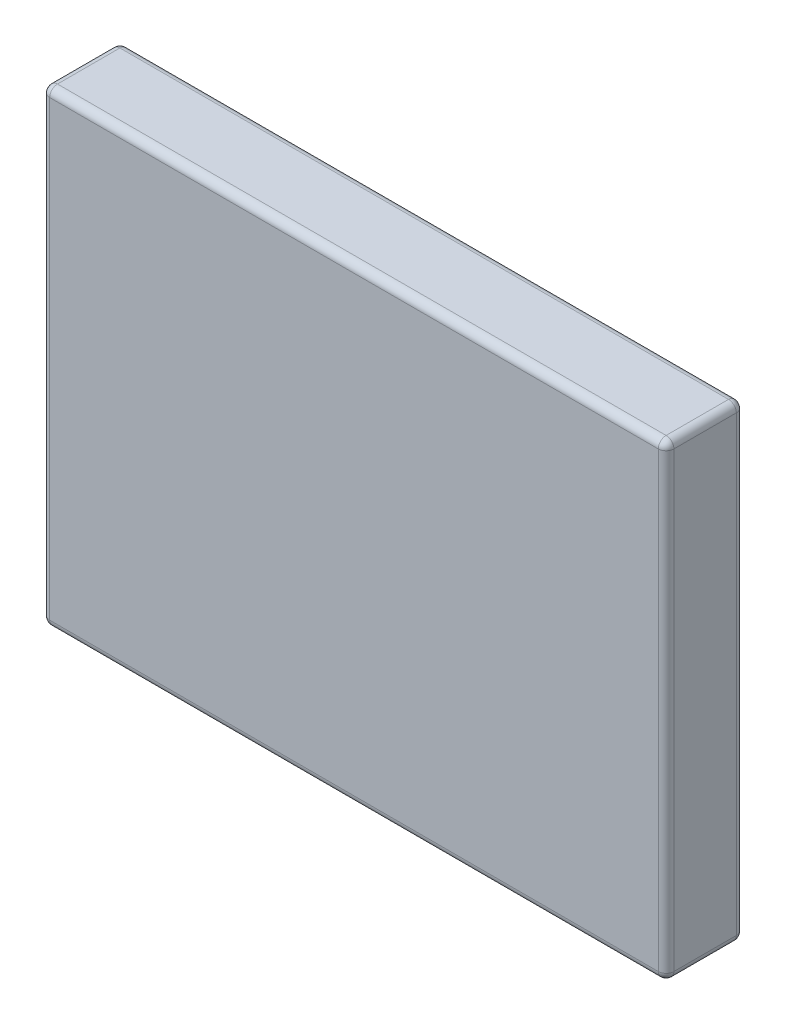
ISO-10303-21;
HEADER;
FILE_DESCRIPTION(('STEP AP214'),'2;1');
FILE_NAME('part.step','',(''),(''),'','','');
FILE_SCHEMA(('AUTOMOTIVE_DESIGN { 1 0 10303 214 1 1 1 1 }'));
ENDSEC;
DATA;
#1=APPLICATION_CONTEXT('core data for automotive mechanical design processes');
#2=APPLICATION_PROTOCOL_DEFINITION('international standard','automotive_design',2000,#1);
#3=PRODUCT_CONTEXT('',#1,'mechanical');
#4=PRODUCT('Part','Part','',(#3));
#5=PRODUCT_RELATED_PRODUCT_CATEGORY('part','',(#4));
#6=PRODUCT_DEFINITION_FORMATION('','',#4);
#7=PRODUCT_DEFINITION_CONTEXT('part definition',#1,'design');
#8=PRODUCT_DEFINITION('design','',#6,#7);
#9=PRODUCT_DEFINITION_SHAPE('','',#8);
#10=(LENGTH_UNIT() NAMED_UNIT(*) SI_UNIT(.MILLI.,.METRE.));
#11=(NAMED_UNIT(*) PLANE_ANGLE_UNIT() SI_UNIT($,.RADIAN.));
#12=(NAMED_UNIT(*) SI_UNIT($,.STERADIAN.) SOLID_ANGLE_UNIT());
#13=UNCERTAINTY_MEASURE_WITH_UNIT(LENGTH_MEASURE(1.E-05),#10,'distance_accuracy_value','');
#14=(GEOMETRIC_REPRESENTATION_CONTEXT(3) GLOBAL_UNCERTAINTY_ASSIGNED_CONTEXT((#13)) GLOBAL_UNIT_ASSIGNED_CONTEXT((#10,
#11,#12)) REPRESENTATION_CONTEXT('',''));
#15=CARTESIAN_POINT('',(0.,0.,0.));
#16=DIRECTION('',(0.,0.,1.));
#17=DIRECTION('',(1.,0.,0.));
#18=AXIS2_PLACEMENT_3D('',#15,#16,#17);
#19=CARTESIAN_POINT('',(0.,0.,12.7));
#20=DIRECTION('',(1.,0.,0.));
#21=DIRECTION('',(0.,0.,-1.));
#22=AXIS2_PLACEMENT_3D('',#19,#20,#21);
#23=PLANE('',#22);
#24=DIRECTION('',(0.,-1.,0.));
#25=VECTOR('',#24,1.);
#26=CARTESIAN_POINT('',(0.,0.,11.43));
#27=LINE('',#26,#25);
#28=CARTESIAN_POINT('',(0.,1.27,11.43));
#29=VERTEX_POINT('',#28);
#30=CARTESIAN_POINT('',(0.,74.93,11.43));
#31=VERTEX_POINT('',#30);
#32=EDGE_CURVE('E157',#29,#31,#27,.F.);
#33=ORIENTED_EDGE('',*,*,#32,.T.);
#34=DIRECTION('',(0.,0.,-1.));
#35=VECTOR('',#34,1.);
#36=CARTESIAN_POINT('',(0.,74.93,12.7));
#37=LINE('',#36,#35);
#38=CARTESIAN_POINT('',(0.,74.93,1.27));
#39=VERTEX_POINT('',#38);
#40=EDGE_CURVE('E165',#31,#39,#37,.T.);
#41=ORIENTED_EDGE('',*,*,#40,.T.);
#42=DIRECTION('',(0.,-1.,0.));
#43=VECTOR('',#42,1.);
#44=CARTESIAN_POINT('',(0.,0.,1.27));
#45=LINE('',#44,#43);
#46=CARTESIAN_POINT('',(0.,1.27,1.27));
#47=VERTEX_POINT('',#46);
#48=EDGE_CURVE('E137',#39,#47,#45,.T.);
#49=ORIENTED_EDGE('',*,*,#48,.T.);
#50=DIRECTION('',(0.,0.,-1.));
#51=VECTOR('',#50,1.);
#52=CARTESIAN_POINT('',(0.,1.27,12.7));
#53=LINE('',#52,#51);
#54=EDGE_CURVE('E152',#47,#29,#53,.F.);
#55=ORIENTED_EDGE('',*,*,#54,.T.);
#56=EDGE_LOOP('',(#33,#41,#49,#55));
#57=FACE_BOUND('',#56,.T.);
#58=ADVANCED_FACE('F39',(#57),#23,.F.);
#59=CARTESIAN_POINT('',(0.,0.,12.7));
#60=DIRECTION('',(0.,1.,0.));
#61=DIRECTION('',(0.,0.,1.));
#62=AXIS2_PLACEMENT_3D('',#59,#60,#61);
#63=PLANE('',#62);
#64=DIRECTION('',(1.,0.,0.));
#65=VECTOR('',#64,1.);
#66=CARTESIAN_POINT('',(101.6,0.,1.27));
#67=LINE('',#66,#65);
#68=CARTESIAN_POINT('',(1.27,0.,1.27));
#69=VERTEX_POINT('',#68);
#70=CARTESIAN_POINT('',(100.33,0.,1.27));
#71=VERTEX_POINT('',#70);
#72=EDGE_CURVE('E176',#69,#71,#67,.T.);
#73=ORIENTED_EDGE('',*,*,#72,.T.);
#74=DIRECTION('',(0.,0.,-1.));
#75=VECTOR('',#74,1.);
#76=CARTESIAN_POINT('',(100.33,0.,12.7));
#77=LINE('',#76,#75);
#78=CARTESIAN_POINT('',(100.33,0.,11.43));
#79=VERTEX_POINT('',#78);
#80=EDGE_CURVE('E185',#71,#79,#77,.F.);
#81=ORIENTED_EDGE('',*,*,#80,.T.);
#82=DIRECTION('',(1.,0.,0.));
#83=VECTOR('',#82,1.);
#84=CARTESIAN_POINT('',(0.,0.,11.43));
#85=LINE('',#84,#83);
#86=CARTESIAN_POINT('',(1.27,0.,11.43));
#87=VERTEX_POINT('',#86);
#88=EDGE_CURVE('E180',#79,#87,#85,.F.);
#89=ORIENTED_EDGE('',*,*,#88,.T.);
#90=DIRECTION('',(0.,0.,-1.));
#91=VECTOR('',#90,1.);
#92=CARTESIAN_POINT('',(1.27,0.,12.7));
#93=LINE('',#92,#91);
#94=EDGE_CURVE('E172',#87,#69,#93,.T.);
#95=ORIENTED_EDGE('',*,*,#94,.T.);
#96=EDGE_LOOP('',(#73,#81,#89,#95));
#97=FACE_BOUND('',#96,.T.);
#98=ADVANCED_FACE('F328',(#97),#63,.F.);
#99=CARTESIAN_POINT('',(101.6,0.,12.7));
#100=DIRECTION('',(-1.,0.,0.));
#101=DIRECTION('',(0.,0.,1.));
#102=AXIS2_PLACEMENT_3D('',#99,#100,#101);
#103=PLANE('',#102);
#104=DIRECTION('',(0.,1.,0.));
#105=VECTOR('',#104,1.);
#106=CARTESIAN_POINT('',(101.6,76.2,1.27));
#107=LINE('',#106,#105);
#108=CARTESIAN_POINT('',(101.6,1.27,1.27));
#109=VERTEX_POINT('',#108);
#110=CARTESIAN_POINT('',(101.6,74.93,1.27));
#111=VERTEX_POINT('',#110);
#112=EDGE_CURVE('E190',#109,#111,#107,.T.);
#113=ORIENTED_EDGE('',*,*,#112,.T.);
#114=DIRECTION('',(0.,0.,-1.));
#115=VECTOR('',#114,1.);
#116=CARTESIAN_POINT('',(101.6,74.93,12.7));
#117=LINE('',#116,#115);
#118=CARTESIAN_POINT('',(101.6,74.93,11.43));
#119=VERTEX_POINT('',#118);
#120=EDGE_CURVE('E192',#111,#119,#117,.F.);
#121=ORIENTED_EDGE('',*,*,#120,.T.);
#122=DIRECTION('',(0.,1.,0.));
#123=VECTOR('',#122,1.);
#124=CARTESIAN_POINT('',(101.6,0.,11.43));
#125=LINE('',#124,#123);
#126=CARTESIAN_POINT('',(101.6,1.27,11.43));
#127=VERTEX_POINT('',#126);
#128=EDGE_CURVE('E189',#119,#127,#125,.F.);
#129=ORIENTED_EDGE('',*,*,#128,.T.);
#130=DIRECTION('',(0.,0.,-1.));
#131=VECTOR('',#130,1.);
#132=CARTESIAN_POINT('',(101.6,1.27,12.7));
#133=LINE('',#132,#131);
#134=EDGE_CURVE('E184',#127,#109,#133,.T.);
#135=ORIENTED_EDGE('',*,*,#134,.T.);
#136=EDGE_LOOP('',(#113,#121,#129,#135));
#137=FACE_BOUND('',#136,.T.);
#138=ADVANCED_FACE('F298',(#137),#103,.F.);
#139=CARTESIAN_POINT('',(0.,76.2,12.7));
#140=DIRECTION('',(0.,-1.,0.));
#141=DIRECTION('',(0.,0.,-1.));
#142=AXIS2_PLACEMENT_3D('',#139,#140,#141);
#143=PLANE('',#142);
#144=DIRECTION('',(-1.,0.,0.));
#145=VECTOR('',#144,1.);
#146=CARTESIAN_POINT('',(0.,76.2,1.27));
#147=LINE('',#146,#145);
#148=CARTESIAN_POINT('',(100.33,76.2,1.27));
#149=VERTEX_POINT('',#148);
#150=CARTESIAN_POINT('',(1.27,76.2,1.27));
#151=VERTEX_POINT('',#150);
#152=EDGE_CURVE('E197',#149,#151,#147,.T.);
#153=ORIENTED_EDGE('',*,*,#152,.T.);
#154=DIRECTION('',(0.,0.,-1.));
#155=VECTOR('',#154,1.);
#156=CARTESIAN_POINT('',(1.27,76.2,12.7));
#157=LINE('',#156,#155);
#158=CARTESIAN_POINT('',(1.27,76.2,11.43));
#159=VERTEX_POINT('',#158);
#160=EDGE_CURVE('E199',#151,#159,#157,.F.);
#161=ORIENTED_EDGE('',*,*,#160,.T.);
#162=DIRECTION('',(-1.,0.,0.));
#163=VECTOR('',#162,1.);
#164=CARTESIAN_POINT('',(0.,76.2,11.43));
#165=LINE('',#164,#163);
#166=CARTESIAN_POINT('',(100.33,76.2,11.43));
#167=VERTEX_POINT('',#166);
#168=EDGE_CURVE('E193',#159,#167,#165,.F.);
#169=ORIENTED_EDGE('',*,*,#168,.T.);
#170=DIRECTION('',(0.,0.,-1.));
#171=VECTOR('',#170,1.);
#172=CARTESIAN_POINT('',(100.33,76.2,12.7));
#173=LINE('',#172,#171);
#174=EDGE_CURVE('E194',#167,#149,#173,.T.);
#175=ORIENTED_EDGE('',*,*,#174,.T.);
#176=EDGE_LOOP('',(#153,#161,#169,#175));
#177=FACE_BOUND('',#176,.T.);
#178=ADVANCED_FACE('F274',(#177),#143,.F.);
#179=CARTESIAN_POINT('',(0.,0.,12.7));
#180=DIRECTION('',(0.,0.,-1.));
#181=DIRECTION('',(-1.,0.,0.));
#182=AXIS2_PLACEMENT_3D('',#179,#180,#181);
#183=PLANE('',#182);
#184=DIRECTION('',(-1.,0.,0.));
#185=VECTOR('',#184,1.);
#186=CARTESIAN_POINT('',(0.,74.93,12.7));
#187=LINE('',#186,#185);
#188=CARTESIAN_POINT('',(100.33,74.93,12.7));
#189=VERTEX_POINT('',#188);
#190=CARTESIAN_POINT('',(1.27,74.93,12.7));
#191=VERTEX_POINT('',#190);
#192=EDGE_CURVE('E205',#189,#191,#187,.T.);
#193=ORIENTED_EDGE('',*,*,#192,.T.);
#194=DIRECTION('',(0.,-1.,0.));
#195=VECTOR('',#194,1.);
#196=CARTESIAN_POINT('',(1.27,0.,12.7));
#197=LINE('',#196,#195);
#198=CARTESIAN_POINT('',(1.27,1.27,12.7));
#199=VERTEX_POINT('',#198);
#200=EDGE_CURVE('E11',#191,#199,#197,.T.);
#201=ORIENTED_EDGE('',*,*,#200,.T.);
#202=DIRECTION('',(1.,0.,0.));
#203=VECTOR('',#202,1.);
#204=CARTESIAN_POINT('',(0.,1.27,12.7));
#205=LINE('',#204,#203);
#206=CARTESIAN_POINT('',(100.33,1.27,12.7));
#207=VERTEX_POINT('',#206);
#208=EDGE_CURVE('E48',#199,#207,#205,.T.);
#209=ORIENTED_EDGE('',*,*,#208,.T.);
#210=DIRECTION('',(0.,1.,0.));
#211=VECTOR('',#210,1.);
#212=CARTESIAN_POINT('',(100.33,0.,12.7));
#213=LINE('',#212,#211);
#214=EDGE_CURVE('E204',#207,#189,#213,.T.);
#215=ORIENTED_EDGE('',*,*,#214,.T.);
#216=EDGE_LOOP('',(#193,#201,#209,#215));
#217=FACE_BOUND('',#216,.T.);
#218=ADVANCED_FACE('F285',(#217),#183,.F.);
#219=CARTESIAN_POINT('',(0.,0.,0.));
#220=DIRECTION('',(0.,0.,-1.));
#221=DIRECTION('',(-1.,0.,0.));
#222=AXIS2_PLACEMENT_3D('',#219,#220,#221);
#223=PLANE('',#222);
#224=DIRECTION('',(1.,0.,0.));
#225=VECTOR('',#224,1.);
#226=CARTESIAN_POINT('',(0.,1.27,0.));
#227=LINE('',#226,#225);
#228=CARTESIAN_POINT('',(100.33,1.27,0.));
#229=VERTEX_POINT('',#228);
#230=CARTESIAN_POINT('',(1.27,1.27,0.));
#231=VERTEX_POINT('',#230);
#232=EDGE_CURVE('E171',#229,#231,#227,.F.);
#233=ORIENTED_EDGE('',*,*,#232,.T.);
#234=DIRECTION('',(0.,-1.,0.));
#235=VECTOR('',#234,1.);
#236=CARTESIAN_POINT('',(1.27,76.2,0.));
#237=LINE('',#236,#235);
#238=CARTESIAN_POINT('',(1.27,74.93,0.));
#239=VERTEX_POINT('',#238);
#240=EDGE_CURVE('E139',#231,#239,#237,.F.);
#241=ORIENTED_EDGE('',*,*,#240,.T.);
#242=DIRECTION('',(-1.,0.,0.));
#243=VECTOR('',#242,1.);
#244=CARTESIAN_POINT('',(101.6,74.93,0.));
#245=LINE('',#244,#243);
#246=CARTESIAN_POINT('',(100.33,74.93,0.));
#247=VERTEX_POINT('',#246);
#248=EDGE_CURVE('E164',#239,#247,#245,.F.);
#249=ORIENTED_EDGE('',*,*,#248,.T.);
#250=DIRECTION('',(0.,1.,0.));
#251=VECTOR('',#250,1.);
#252=CARTESIAN_POINT('',(100.33,0.,0.));
#253=LINE('',#252,#251);
#254=EDGE_CURVE('E168',#247,#229,#253,.F.);
#255=ORIENTED_EDGE('',*,*,#254,.T.);
#256=EDGE_LOOP('',(#233,#241,#249,#255));
#257=FACE_BOUND('',#256,.T.);
#258=ADVANCED_FACE('F362',(#257),#223,.T.);
#259=CARTESIAN_POINT('',(100.33,0.,11.43));
#260=DIRECTION('',(0.,1.,0.));
#261=DIRECTION('',(0.,0.,1.));
#262=AXIS2_PLACEMENT_3D('',#259,#260,#261);
#263=CYLINDRICAL_SURFACE('',#262,1.27);
#264=CARTESIAN_POINT('',(100.33,74.93,11.43));
#265=DIRECTION('',(0.,1.,0.));
#266=DIRECTION('',(0.,0.,1.));
#267=AXIS2_PLACEMENT_3D('',#264,#265,#266);
#268=CIRCLE('',#267,1.27);
#269=EDGE_CURVE('E43',#189,#119,#268,.T.);
#270=ORIENTED_EDGE('',*,*,#269,.F.);
#271=ORIENTED_EDGE('',*,*,#214,.F.);
#272=CARTESIAN_POINT('',(100.33,1.27,11.43));
#273=DIRECTION('',(0.,-1.,0.));
#274=DIRECTION('',(0.,0.,-1.));
#275=AXIS2_PLACEMENT_3D('',#272,#273,#274);
#276=CIRCLE('',#275,1.27);
#277=EDGE_CURVE('E251',#127,#207,#276,.T.);
#278=ORIENTED_EDGE('',*,*,#277,.F.);
#279=ORIENTED_EDGE('',*,*,#128,.F.);
#280=EDGE_LOOP('',(#270,#271,#278,#279));
#281=FACE_BOUND('',#280,.T.);
#282=ADVANCED_FACE('F41',(#281),#263,.T.);
#283=CARTESIAN_POINT('',(100.33,74.93,11.43));
#284=DIRECTION('',(1.,0.,0.));
#285=DIRECTION('',(0.,0.,-1.));
#286=AXIS2_PLACEMENT_3D('',#283,#284,#285);
#287=SPHERICAL_SURFACE('',#286,1.27);
#288=CARTESIAN_POINT('',(100.33,74.93,11.43));
#289=DIRECTION('',(1.,0.,0.));
#290=DIRECTION('',(0.,0.,-1.));
#291=AXIS2_PLACEMENT_3D('',#288,#289,#290);
#292=CIRCLE('',#291,1.27);
#293=EDGE_CURVE('E249',#189,#167,#292,.F.);
#294=ORIENTED_EDGE('',*,*,#293,.F.);
#295=ORIENTED_EDGE('',*,*,#269,.T.);
#296=CARTESIAN_POINT('',(100.33,74.93,11.43));
#297=DIRECTION('',(0.,0.,1.));
#298=DIRECTION('',(1.,0.,0.));
#299=AXIS2_PLACEMENT_3D('',#296,#297,#298);
#300=CIRCLE('',#299,1.27);
#301=EDGE_CURVE('E253',#167,#119,#300,.F.);
#302=ORIENTED_EDGE('',*,*,#301,.F.);
#303=EDGE_LOOP('',(#294,#295,#302));
#304=FACE_BOUND('',#303,.T.);
#305=ADVANCED_FACE('F262',(#304),#287,.T.);
#306=CARTESIAN_POINT('',(100.33,1.27,11.43));
#307=DIRECTION('',(0.,0.,1.));
#308=DIRECTION('',(1.,0.,0.));
#309=AXIS2_PLACEMENT_3D('',#306,#307,#308);
#310=SPHERICAL_SURFACE('',#309,1.27);
#311=CARTESIAN_POINT('',(100.33,1.27,11.43));
#312=DIRECTION('',(0.,0.,1.));
#313=DIRECTION('',(1.,0.,0.));
#314=AXIS2_PLACEMENT_3D('',#311,#312,#313);
#315=CIRCLE('',#314,1.27);
#316=EDGE_CURVE('E241',#127,#79,#315,.F.);
#317=ORIENTED_EDGE('',*,*,#316,.F.);
#318=ORIENTED_EDGE('',*,*,#277,.T.);
#319=CARTESIAN_POINT('',(100.33,1.27,11.43));
#320=DIRECTION('',(1.,0.,0.));
#321=DIRECTION('',(0.,0.,-1.));
#322=AXIS2_PLACEMENT_3D('',#319,#320,#321);
#323=CIRCLE('',#322,1.27);
#324=EDGE_CURVE('E242',#79,#207,#323,.F.);
#325=ORIENTED_EDGE('',*,*,#324,.F.);
#326=EDGE_LOOP('',(#317,#318,#325));
#327=FACE_BOUND('',#326,.T.);
#328=ADVANCED_FACE('F292',(#327),#310,.T.);
#329=CARTESIAN_POINT('',(100.33,74.93,12.7));
#330=DIRECTION('',(0.,0.,-1.));
#331=DIRECTION('',(-1.,0.,0.));
#332=AXIS2_PLACEMENT_3D('',#329,#330,#331);
#333=CYLINDRICAL_SURFACE('',#332,1.27);
#334=ORIENTED_EDGE('',*,*,#301,.T.);
#335=ORIENTED_EDGE('',*,*,#120,.F.);
#336=CARTESIAN_POINT('',(100.33,74.93,1.27));
#337=DIRECTION('',(0.,0.,-1.));
#338=DIRECTION('',(-1.,0.,0.));
#339=AXIS2_PLACEMENT_3D('',#336,#337,#338);
#340=CIRCLE('',#339,1.27);
#341=EDGE_CURVE('E240',#149,#111,#340,.T.);
#342=ORIENTED_EDGE('',*,*,#341,.F.);
#343=ORIENTED_EDGE('',*,*,#174,.F.);
#344=EDGE_LOOP('',(#334,#335,#342,#343));
#345=FACE_BOUND('',#344,.T.);
#346=ADVANCED_FACE('F271',(#345),#333,.T.);
#347=CARTESIAN_POINT('',(0.,74.93,11.43));
#348=DIRECTION('',(-1.,0.,0.));
#349=DIRECTION('',(0.,0.,1.));
#350=AXIS2_PLACEMENT_3D('',#347,#348,#349);
#351=CYLINDRICAL_SURFACE('',#350,1.27);
#352=ORIENTED_EDGE('',*,*,#293,.T.);
#353=ORIENTED_EDGE('',*,*,#168,.F.);
#354=CARTESIAN_POINT('',(1.27,74.93,11.43));
#355=DIRECTION('',(-1.,0.,0.));
#356=DIRECTION('',(0.,0.,1.));
#357=AXIS2_PLACEMENT_3D('',#354,#355,#356);
#358=CIRCLE('',#357,1.27);
#359=EDGE_CURVE('E231',#191,#159,#358,.T.);
#360=ORIENTED_EDGE('',*,*,#359,.F.);
#361=ORIENTED_EDGE('',*,*,#192,.F.);
#362=EDGE_LOOP('',(#352,#353,#360,#361));
#363=FACE_BOUND('',#362,.T.);
#364=ADVANCED_FACE('F284',(#363),#351,.T.);
#365=CARTESIAN_POINT('',(1.27,0.,11.43));
#366=DIRECTION('',(0.,-1.,0.));
#367=DIRECTION('',(0.,0.,-1.));
#368=AXIS2_PLACEMENT_3D('',#365,#366,#367);
#369=CYLINDRICAL_SURFACE('',#368,1.27);
#370=CARTESIAN_POINT('',(1.27,1.27,11.43));
#371=DIRECTION('',(0.,-1.,0.));
#372=DIRECTION('',(0.,0.,-1.));
#373=AXIS2_PLACEMENT_3D('',#370,#371,#372);
#374=CIRCLE('',#373,1.27);
#375=EDGE_CURVE('E228',#199,#29,#374,.T.);
#376=ORIENTED_EDGE('',*,*,#375,.F.);
#377=ORIENTED_EDGE('',*,*,#200,.F.);
#378=CARTESIAN_POINT('',(1.27,74.93,11.43));
#379=DIRECTION('',(0.,1.,0.));
#380=DIRECTION('',(0.,0.,1.));
#381=AXIS2_PLACEMENT_3D('',#378,#379,#380);
#382=CIRCLE('',#381,1.27);
#383=EDGE_CURVE('E232',#31,#191,#382,.T.);
#384=ORIENTED_EDGE('',*,*,#383,.F.);
#385=ORIENTED_EDGE('',*,*,#32,.F.);
#386=EDGE_LOOP('',(#376,#377,#384,#385));
#387=FACE_BOUND('',#386,.T.);
#388=ADVANCED_FACE('F287',(#387),#369,.T.);
#389=CARTESIAN_POINT('',(0.,1.27,11.43));
#390=DIRECTION('',(1.,0.,0.));
#391=DIRECTION('',(0.,0.,-1.));
#392=AXIS2_PLACEMENT_3D('',#389,#390,#391);
#393=CYLINDRICAL_SURFACE('',#392,1.27);
#394=ORIENTED_EDGE('',*,*,#324,.T.);
#395=ORIENTED_EDGE('',*,*,#208,.F.);
#396=CARTESIAN_POINT('',(1.27,1.27,11.43));
#397=DIRECTION('',(-1.,0.,0.));
#398=DIRECTION('',(0.,0.,1.));
#399=AXIS2_PLACEMENT_3D('',#396,#397,#398);
#400=CIRCLE('',#399,1.27);
#401=EDGE_CURVE('E57',#87,#199,#400,.T.);
#402=ORIENTED_EDGE('',*,*,#401,.F.);
#403=ORIENTED_EDGE('',*,*,#88,.F.);
#404=EDGE_LOOP('',(#394,#395,#402,#403));
#405=FACE_BOUND('',#404,.T.);
#406=ADVANCED_FACE('F286',(#405),#393,.T.);
#407=CARTESIAN_POINT('',(100.33,1.27,12.7));
#408=DIRECTION('',(0.,0.,-1.));
#409=DIRECTION('',(-1.,0.,0.));
#410=AXIS2_PLACEMENT_3D('',#407,#408,#409);
#411=CYLINDRICAL_SURFACE('',#410,1.27);
#412=ORIENTED_EDGE('',*,*,#316,.T.);
#413=ORIENTED_EDGE('',*,*,#80,.F.);
#414=CARTESIAN_POINT('',(100.33,1.27,1.27));
#415=DIRECTION('',(0.,0.,-1.));
#416=DIRECTION('',(-1.,0.,0.));
#417=AXIS2_PLACEMENT_3D('',#414,#415,#416);
#418=CIRCLE('',#417,1.27);
#419=EDGE_CURVE('E223',#109,#71,#418,.T.);
#420=ORIENTED_EDGE('',*,*,#419,.F.);
#421=ORIENTED_EDGE('',*,*,#134,.F.);
#422=EDGE_LOOP('',(#412,#413,#420,#421));
#423=FACE_BOUND('',#422,.T.);
#424=ADVANCED_FACE('F299',(#423),#411,.T.);
#425=CARTESIAN_POINT('',(100.33,0.,1.27));
#426=DIRECTION('',(0.,-1.,0.));
#427=DIRECTION('',(0.,0.,-1.));
#428=AXIS2_PLACEMENT_3D('',#425,#426,#427);
#429=CYLINDRICAL_SURFACE('',#428,1.27);
#430=CARTESIAN_POINT('',(100.33,74.93,1.27));
#431=DIRECTION('',(0.,1.,0.));
#432=DIRECTION('',(0.,0.,1.));
#433=AXIS2_PLACEMENT_3D('',#430,#431,#432);
#434=CIRCLE('',#433,1.27);
#435=EDGE_CURVE('E239',#111,#247,#434,.T.);
#436=ORIENTED_EDGE('',*,*,#435,.F.);
#437=ORIENTED_EDGE('',*,*,#112,.F.);
#438=CARTESIAN_POINT('',(100.33,1.27,1.27));
#439=DIRECTION('',(0.,-1.,0.));
#440=DIRECTION('',(0.,0.,-1.));
#441=AXIS2_PLACEMENT_3D('',#438,#439,#440);
#442=CIRCLE('',#441,1.27);
#443=EDGE_CURVE('E225',#229,#109,#442,.T.);
#444=ORIENTED_EDGE('',*,*,#443,.F.);
#445=ORIENTED_EDGE('',*,*,#254,.F.);
#446=EDGE_LOOP('',(#436,#437,#444,#445));
#447=FACE_BOUND('',#446,.T.);
#448=ADVANCED_FACE('F304',(#447),#429,.T.);
#449=CARTESIAN_POINT('',(100.33,74.93,1.27));
#450=DIRECTION('',(1.,0.,0.));
#451=DIRECTION('',(0.,0.,-1.));
#452=AXIS2_PLACEMENT_3D('',#449,#450,#451);
#453=SPHERICAL_SURFACE('',#452,1.27);
#454=ORIENTED_EDGE('',*,*,#341,.T.);
#455=ORIENTED_EDGE('',*,*,#435,.T.);
#456=CARTESIAN_POINT('',(100.33,74.93,1.27));
#457=DIRECTION('',(1.,0.,0.));
#458=DIRECTION('',(0.,0.,-1.));
#459=AXIS2_PLACEMENT_3D('',#456,#457,#458);
#460=CIRCLE('',#459,1.27);
#461=EDGE_CURVE('E218',#149,#247,#460,.F.);
#462=ORIENTED_EDGE('',*,*,#461,.F.);
#463=EDGE_LOOP('',(#454,#455,#462));
#464=FACE_BOUND('',#463,.T.);
#465=ADVANCED_FACE('F307',(#464),#453,.T.);
#466=CARTESIAN_POINT('',(1.27,74.93,11.43));
#467=DIRECTION('',(0.,0.,1.));
#468=DIRECTION('',(1.,0.,0.));
#469=AXIS2_PLACEMENT_3D('',#466,#467,#468);
#470=SPHERICAL_SURFACE('',#469,1.27);
#471=ORIENTED_EDGE('',*,*,#383,.T.);
#472=ORIENTED_EDGE('',*,*,#359,.T.);
#473=CARTESIAN_POINT('',(1.27,74.93,11.43));
#474=DIRECTION('',(0.,0.,1.));
#475=DIRECTION('',(1.,0.,0.));
#476=AXIS2_PLACEMENT_3D('',#473,#474,#475);
#477=CIRCLE('',#476,1.27);
#478=EDGE_CURVE('E216',#31,#159,#477,.F.);
#479=ORIENTED_EDGE('',*,*,#478,.F.);
#480=EDGE_LOOP('',(#471,#472,#479));
#481=FACE_BOUND('',#480,.T.);
#482=ADVANCED_FACE('F320',(#481),#470,.T.);
#483=CARTESIAN_POINT('',(1.27,1.27,11.43));
#484=DIRECTION('',(0.,0.,1.));
#485=DIRECTION('',(1.,0.,0.));
#486=AXIS2_PLACEMENT_3D('',#483,#484,#485);
#487=SPHERICAL_SURFACE('',#486,1.27);
#488=ORIENTED_EDGE('',*,*,#401,.T.);
#489=ORIENTED_EDGE('',*,*,#375,.T.);
#490=CARTESIAN_POINT('',(1.27,1.27,11.43));
#491=DIRECTION('',(0.,0.,1.));
#492=DIRECTION('',(1.,0.,0.));
#493=AXIS2_PLACEMENT_3D('',#490,#491,#492);
#494=CIRCLE('',#493,1.27);
#495=EDGE_CURVE('E156',#87,#29,#494,.F.);
#496=ORIENTED_EDGE('',*,*,#495,.F.);
#497=EDGE_LOOP('',(#488,#489,#496));
#498=FACE_BOUND('',#497,.T.);
#499=ADVANCED_FACE('F317',(#498),#487,.T.);
#500=CARTESIAN_POINT('',(100.33,1.27,1.27));
#501=DIRECTION('',(1.,0.,0.));
#502=DIRECTION('',(0.,0.,-1.));
#503=AXIS2_PLACEMENT_3D('',#500,#501,#502);
#504=SPHERICAL_SURFACE('',#503,1.27);
#505=ORIENTED_EDGE('',*,*,#443,.T.);
#506=ORIENTED_EDGE('',*,*,#419,.T.);
#507=CARTESIAN_POINT('',(100.33,1.27,1.27));
#508=DIRECTION('',(1.,0.,0.));
#509=DIRECTION('',(0.,0.,-1.));
#510=AXIS2_PLACEMENT_3D('',#507,#508,#509);
#511=CIRCLE('',#510,1.27);
#512=EDGE_CURVE('E213',#229,#71,#511,.F.);
#513=ORIENTED_EDGE('',*,*,#512,.F.);
#514=EDGE_LOOP('',(#505,#506,#513));
#515=FACE_BOUND('',#514,.T.);
#516=ADVANCED_FACE('F324',(#515),#504,.T.);
#517=CARTESIAN_POINT('',(0.,74.93,1.27));
#518=DIRECTION('',(1.,0.,0.));
#519=DIRECTION('',(0.,0.,-1.));
#520=AXIS2_PLACEMENT_3D('',#517,#518,#519);
#521=CYLINDRICAL_SURFACE('',#520,1.27);
#522=ORIENTED_EDGE('',*,*,#461,.T.);
#523=ORIENTED_EDGE('',*,*,#248,.F.);
#524=CARTESIAN_POINT('',(1.27,74.93,1.27));
#525=DIRECTION('',(-1.,0.,0.));
#526=DIRECTION('',(0.,0.,1.));
#527=AXIS2_PLACEMENT_3D('',#524,#525,#526);
#528=CIRCLE('',#527,1.27);
#529=EDGE_CURVE('E209',#151,#239,#528,.T.);
#530=ORIENTED_EDGE('',*,*,#529,.F.);
#531=ORIENTED_EDGE('',*,*,#152,.F.);
#532=EDGE_LOOP('',(#522,#523,#530,#531));
#533=FACE_BOUND('',#532,.T.);
#534=ADVANCED_FACE('F309',(#533),#521,.T.);
#535=CARTESIAN_POINT('',(1.27,74.93,12.7));
#536=DIRECTION('',(0.,0.,-1.));
#537=DIRECTION('',(-1.,0.,0.));
#538=AXIS2_PLACEMENT_3D('',#535,#536,#537);
#539=CYLINDRICAL_SURFACE('',#538,1.27);
#540=ORIENTED_EDGE('',*,*,#478,.T.);
#541=ORIENTED_EDGE('',*,*,#160,.F.);
#542=CARTESIAN_POINT('',(1.27,74.93,1.27));
#543=DIRECTION('',(0.,0.,-1.));
#544=DIRECTION('',(-1.,0.,0.));
#545=AXIS2_PLACEMENT_3D('',#542,#543,#544);
#546=CIRCLE('',#545,1.27);
#547=EDGE_CURVE('E151',#39,#151,#546,.T.);
#548=ORIENTED_EDGE('',*,*,#547,.F.);
#549=ORIENTED_EDGE('',*,*,#40,.F.);
#550=EDGE_LOOP('',(#540,#541,#548,#549));
#551=FACE_BOUND('',#550,.T.);
#552=ADVANCED_FACE('F312',(#551),#539,.T.);
#553=CARTESIAN_POINT('',(1.27,1.27,12.7));
#554=DIRECTION('',(0.,0.,-1.));
#555=DIRECTION('',(-1.,0.,0.));
#556=AXIS2_PLACEMENT_3D('',#553,#554,#555);
#557=CYLINDRICAL_SURFACE('',#556,1.27);
#558=ORIENTED_EDGE('',*,*,#495,.T.);
#559=ORIENTED_EDGE('',*,*,#54,.F.);
#560=CARTESIAN_POINT('',(1.27,1.27,1.27));
#561=DIRECTION('',(0.,0.,-1.));
#562=DIRECTION('',(-1.,0.,0.));
#563=AXIS2_PLACEMENT_3D('',#560,#561,#562);
#564=CIRCLE('',#563,1.27);
#565=EDGE_CURVE('E145',#69,#47,#564,.T.);
#566=ORIENTED_EDGE('',*,*,#565,.F.);
#567=ORIENTED_EDGE('',*,*,#94,.F.);
#568=EDGE_LOOP('',(#558,#559,#566,#567));
#569=FACE_BOUND('',#568,.T.);
#570=ADVANCED_FACE('F154',(#569),#557,.T.);
#571=CARTESIAN_POINT('',(0.,1.27,1.27));
#572=DIRECTION('',(-1.,0.,0.));
#573=DIRECTION('',(0.,0.,1.));
#574=AXIS2_PLACEMENT_3D('',#571,#572,#573);
#575=CYLINDRICAL_SURFACE('',#574,1.27);
#576=ORIENTED_EDGE('',*,*,#512,.T.);
#577=ORIENTED_EDGE('',*,*,#72,.F.);
#578=CARTESIAN_POINT('',(1.27,1.27,1.27));
#579=DIRECTION('',(-1.,0.,0.));
#580=DIRECTION('',(0.,0.,1.));
#581=AXIS2_PLACEMENT_3D('',#578,#579,#580);
#582=CIRCLE('',#581,1.27);
#583=EDGE_CURVE('E146',#231,#69,#582,.T.);
#584=ORIENTED_EDGE('',*,*,#583,.F.);
#585=ORIENTED_EDGE('',*,*,#232,.F.);
#586=EDGE_LOOP('',(#576,#577,#584,#585));
#587=FACE_BOUND('',#586,.T.);
#588=ADVANCED_FACE('F343',(#587),#575,.T.);
#589=CARTESIAN_POINT('',(1.27,74.93,1.27));
#590=DIRECTION('',(0.,1.,0.));
#591=DIRECTION('',(0.,0.,1.));
#592=AXIS2_PLACEMENT_3D('',#589,#590,#591);
#593=SPHERICAL_SURFACE('',#592,1.27);
#594=ORIENTED_EDGE('',*,*,#547,.T.);
#595=ORIENTED_EDGE('',*,*,#529,.T.);
#596=CARTESIAN_POINT('',(1.27,74.93,1.27));
#597=DIRECTION('',(0.,1.,0.));
#598=DIRECTION('',(0.,0.,1.));
#599=AXIS2_PLACEMENT_3D('',#596,#597,#598);
#600=CIRCLE('',#599,1.27);
#601=EDGE_CURVE('E143',#39,#239,#600,.F.);
#602=ORIENTED_EDGE('',*,*,#601,.F.);
#603=EDGE_LOOP('',(#594,#595,#602));
#604=FACE_BOUND('',#603,.T.);
#605=ADVANCED_FACE('F345',(#604),#593,.T.);
#606=CARTESIAN_POINT('',(1.27,1.27,1.27));
#607=DIRECTION('',(0.,-1.,0.));
#608=DIRECTION('',(0.,0.,-1.));
#609=AXIS2_PLACEMENT_3D('',#606,#607,#608);
#610=SPHERICAL_SURFACE('',#609,1.27);
#611=ORIENTED_EDGE('',*,*,#583,.T.);
#612=ORIENTED_EDGE('',*,*,#565,.T.);
#613=CARTESIAN_POINT('',(1.27,1.27,1.27));
#614=DIRECTION('',(0.,-1.,0.));
#615=DIRECTION('',(0.,0.,-1.));
#616=AXIS2_PLACEMENT_3D('',#613,#614,#615);
#617=CIRCLE('',#616,1.27);
#618=EDGE_CURVE('E131',#231,#47,#617,.F.);
#619=ORIENTED_EDGE('',*,*,#618,.F.);
#620=EDGE_LOOP('',(#611,#612,#619));
#621=FACE_BOUND('',#620,.T.);
#622=ADVANCED_FACE('F148',(#621),#610,.T.);
#623=CARTESIAN_POINT('',(1.27,0.,1.27));
#624=DIRECTION('',(0.,1.,0.));
#625=DIRECTION('',(0.,0.,1.));
#626=AXIS2_PLACEMENT_3D('',#623,#624,#625);
#627=CYLINDRICAL_SURFACE('',#626,1.27);
#628=ORIENTED_EDGE('',*,*,#601,.T.);
#629=ORIENTED_EDGE('',*,*,#240,.F.);
#630=ORIENTED_EDGE('',*,*,#618,.T.);
#631=ORIENTED_EDGE('',*,*,#48,.F.);
#632=EDGE_LOOP('',(#628,#629,#630,#631));
#633=FACE_BOUND('',#632,.T.);
#634=ADVANCED_FACE('F133',(#633),#627,.T.);
#635=CLOSED_SHELL('',(#58,#98,#138,#178,#218,#258,#282,#305,#328,#346,#364,#388,#406,#424,#448,
#465,#482,#499,#516,#534,#552,#570,#588,#605,#622,#634));
#636=MANIFOLD_SOLID_BREP('B2',#635);
#637=ADVANCED_BREP_SHAPE_REPRESENTATION('',(#18,#636),#14);
#638=SHAPE_DEFINITION_REPRESENTATION(#9,#637);
ENDSEC;
END-ISO-10303-21;
